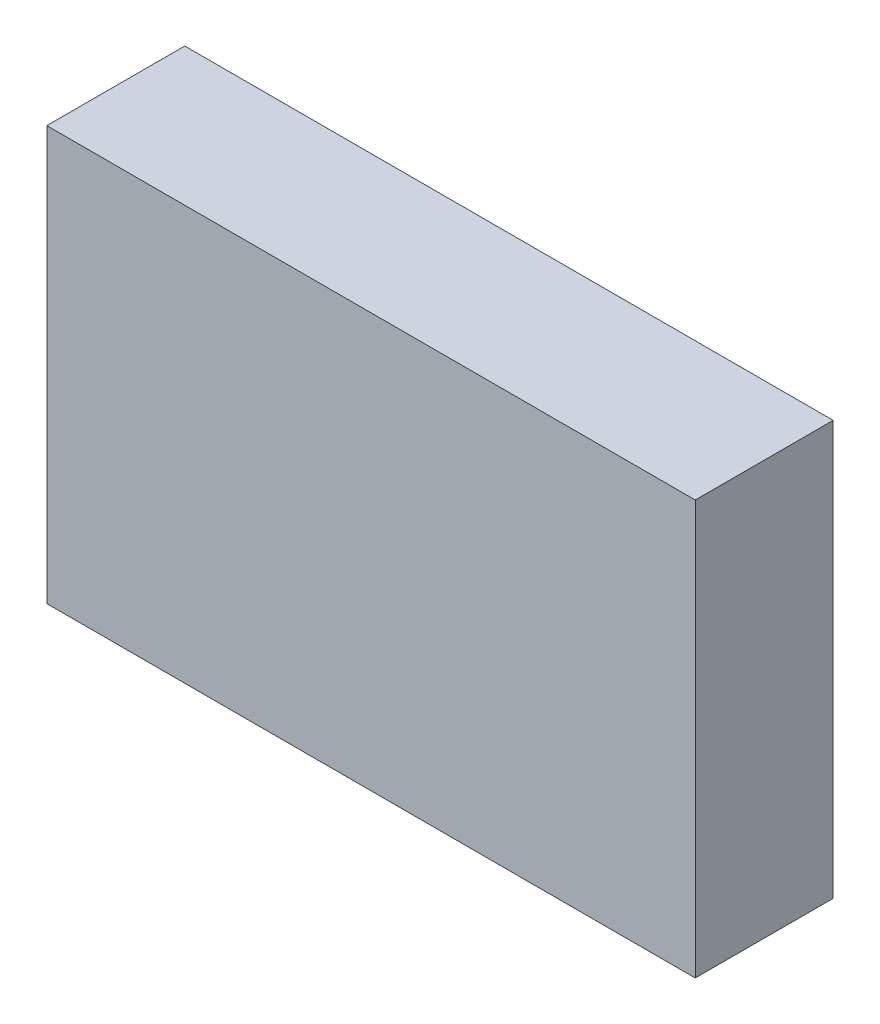
ISO-10303-21;
HEADER;
FILE_DESCRIPTION(('STEP AP214'),'2;1');
FILE_NAME('part.step','',(''),(''),'','','');
FILE_SCHEMA(('AUTOMOTIVE_DESIGN { 1 0 10303 214 1 1 1 1 }'));
ENDSEC;
DATA;
#1=APPLICATION_CONTEXT('core data for automotive mechanical design processes');
#2=APPLICATION_PROTOCOL_DEFINITION('international standard','automotive_design',2000,#1);
#3=PRODUCT_CONTEXT('',#1,'mechanical');
#4=PRODUCT('Part','Part','',(#3));
#5=PRODUCT_RELATED_PRODUCT_CATEGORY('part','',(#4));
#6=PRODUCT_DEFINITION_FORMATION('','',#4);
#7=PRODUCT_DEFINITION_CONTEXT('part definition',#1,'design');
#8=PRODUCT_DEFINITION('design','',#6,#7);
#9=PRODUCT_DEFINITION_SHAPE('','',#8);
#10=(LENGTH_UNIT() NAMED_UNIT(*) SI_UNIT(.MILLI.,.METRE.));
#11=(NAMED_UNIT(*) PLANE_ANGLE_UNIT() SI_UNIT($,.RADIAN.));
#12=(NAMED_UNIT(*) SI_UNIT($,.STERADIAN.) SOLID_ANGLE_UNIT());
#13=UNCERTAINTY_MEASURE_WITH_UNIT(LENGTH_MEASURE(1.E-05),#10,'distance_accuracy_value','');
#14=(GEOMETRIC_REPRESENTATION_CONTEXT(3) GLOBAL_UNCERTAINTY_ASSIGNED_CONTEXT((#13)) GLOBAL_UNIT_ASSIGNED_CONTEXT((#10,
#11,#12)) REPRESENTATION_CONTEXT('',''));
#15=CARTESIAN_POINT('',(0.,0.,0.));
#16=DIRECTION('',(0.,0.,1.));
#17=DIRECTION('',(1.,0.,0.));
#18=AXIS2_PLACEMENT_3D('',#15,#16,#17);
#19=CARTESIAN_POINT('',(-2.4016,-1.45,1.));
#20=DIRECTION('',(1.,0.,0.));
#21=DIRECTION('',(0.,0.,-1.));
#22=AXIS2_PLACEMENT_3D('',#19,#20,#21);
#23=PLANE('',#22);
#24=DIRECTION('',(0.,-1.,0.));
#25=VECTOR('',#24,1.);
#26=CARTESIAN_POINT('',(-2.4016,-1.45,0.));
#27=LINE('',#26,#25);
#28=CARTESIAN_POINT('',(-2.4016,1.5516,0.));
#29=VERTEX_POINT('',#28);
#30=CARTESIAN_POINT('',(-2.4016,-1.45,0.));
#31=VERTEX_POINT('',#30);
#32=EDGE_CURVE('E95',#29,#31,#27,.T.);
#33=ORIENTED_EDGE('',*,*,#32,.T.);
#34=DIRECTION('',(0.,0.,-1.));
#35=VECTOR('',#34,1.);
#36=CARTESIAN_POINT('',(-2.4016,-1.45,1.));
#37=LINE('',#36,#35);
#38=CARTESIAN_POINT('',(-2.4016,-1.45,1.));
#39=VERTEX_POINT('',#38);
#40=EDGE_CURVE('E11',#39,#31,#37,.T.);
#41=ORIENTED_EDGE('',*,*,#40,.F.);
#42=DIRECTION('',(0.,-1.,0.));
#43=VECTOR('',#42,1.);
#44=CARTESIAN_POINT('',(-2.4016,-1.45,1.));
#45=LINE('',#44,#43);
#46=CARTESIAN_POINT('',(-2.4016,1.5516,1.));
#47=VERTEX_POINT('',#46);
#48=EDGE_CURVE('E83',#47,#39,#45,.T.);
#49=ORIENTED_EDGE('',*,*,#48,.F.);
#50=DIRECTION('',(0.,0.,-1.));
#51=VECTOR('',#50,1.);
#52=CARTESIAN_POINT('',(-2.4016,1.5516,1.));
#53=LINE('',#52,#51);
#54=EDGE_CURVE('E91',#47,#29,#53,.T.);
#55=ORIENTED_EDGE('',*,*,#54,.T.);
#56=EDGE_LOOP('',(#33,#41,#49,#55));
#57=FACE_BOUND('',#56,.T.);
#58=ADVANCED_FACE('F32',(#57),#23,.F.);
#59=CARTESIAN_POINT('',(2.3,-1.45,1.));
#60=DIRECTION('',(0.,1.,0.));
#61=DIRECTION('',(0.,0.,1.));
#62=AXIS2_PLACEMENT_3D('',#59,#60,#61);
#63=PLANE('',#62);
#64=DIRECTION('',(1.,0.,0.));
#65=VECTOR('',#64,1.);
#66=CARTESIAN_POINT('',(2.3,-1.45,0.));
#67=LINE('',#66,#65);
#68=CARTESIAN_POINT('',(2.3,-1.45,0.));
#69=VERTEX_POINT('',#68);
#70=EDGE_CURVE('E87',#31,#69,#67,.T.);
#71=ORIENTED_EDGE('',*,*,#70,.T.);
#72=DIRECTION('',(0.,0.,-1.));
#73=VECTOR('',#72,1.);
#74=CARTESIAN_POINT('',(2.3,-1.45,1.));
#75=LINE('',#74,#73);
#76=CARTESIAN_POINT('',(2.3,-1.45,1.));
#77=VERTEX_POINT('',#76);
#78=EDGE_CURVE('E40',#77,#69,#75,.T.);
#79=ORIENTED_EDGE('',*,*,#78,.F.);
#80=DIRECTION('',(1.,0.,0.));
#81=VECTOR('',#80,1.);
#82=CARTESIAN_POINT('',(2.3,-1.45,1.));
#83=LINE('',#82,#81);
#84=EDGE_CURVE('E78',#39,#77,#83,.T.);
#85=ORIENTED_EDGE('',*,*,#84,.F.);
#86=ORIENTED_EDGE('',*,*,#40,.T.);
#87=EDGE_LOOP('',(#71,#79,#85,#86));
#88=FACE_BOUND('',#87,.T.);
#89=ADVANCED_FACE('F86',(#88),#63,.F.);
#90=CARTESIAN_POINT('',(2.3,1.5516,1.));
#91=DIRECTION('',(-1.,0.,0.));
#92=DIRECTION('',(0.,0.,1.));
#93=AXIS2_PLACEMENT_3D('',#90,#91,#92);
#94=PLANE('',#93);
#95=DIRECTION('',(0.,1.,0.));
#96=VECTOR('',#95,1.);
#97=CARTESIAN_POINT('',(2.3,1.5516,0.));
#98=LINE('',#97,#96);
#99=CARTESIAN_POINT('',(2.3,1.5516,0.));
#100=VERTEX_POINT('',#99);
#101=EDGE_CURVE('E65',#69,#100,#98,.T.);
#102=ORIENTED_EDGE('',*,*,#101,.T.);
#103=DIRECTION('',(0.,0.,-1.));
#104=VECTOR('',#103,1.);
#105=CARTESIAN_POINT('',(2.3,1.5516,1.));
#106=LINE('',#105,#104);
#107=CARTESIAN_POINT('',(2.3,1.5516,1.));
#108=VERTEX_POINT('',#107);
#109=EDGE_CURVE('E88',#108,#100,#106,.T.);
#110=ORIENTED_EDGE('',*,*,#109,.F.);
#111=DIRECTION('',(0.,1.,0.));
#112=VECTOR('',#111,1.);
#113=CARTESIAN_POINT('',(2.3,1.5516,1.));
#114=LINE('',#113,#112);
#115=EDGE_CURVE('E81',#77,#108,#114,.T.);
#116=ORIENTED_EDGE('',*,*,#115,.F.);
#117=ORIENTED_EDGE('',*,*,#78,.T.);
#118=EDGE_LOOP('',(#102,#110,#116,#117));
#119=FACE_BOUND('',#118,.T.);
#120=ADVANCED_FACE('F89',(#119),#94,.F.);
#121=CARTESIAN_POINT('',(-2.4016,1.5516,1.));
#122=DIRECTION('',(0.,-1.,0.));
#123=DIRECTION('',(0.,0.,-1.));
#124=AXIS2_PLACEMENT_3D('',#121,#122,#123);
#125=PLANE('',#124);
#126=DIRECTION('',(-1.,0.,0.));
#127=VECTOR('',#126,1.);
#128=CARTESIAN_POINT('',(-2.4016,1.5516,0.));
#129=LINE('',#128,#127);
#130=EDGE_CURVE('E71',#100,#29,#129,.T.);
#131=ORIENTED_EDGE('',*,*,#130,.T.);
#132=ORIENTED_EDGE('',*,*,#54,.F.);
#133=DIRECTION('',(-1.,0.,0.));
#134=VECTOR('',#133,1.);
#135=CARTESIAN_POINT('',(-2.4016,1.5516,1.));
#136=LINE('',#135,#134);
#137=EDGE_CURVE('E48',#108,#47,#136,.T.);
#138=ORIENTED_EDGE('',*,*,#137,.F.);
#139=ORIENTED_EDGE('',*,*,#109,.T.);
#140=EDGE_LOOP('',(#131,#132,#138,#139));
#141=FACE_BOUND('',#140,.T.);
#142=ADVANCED_FACE('F102',(#141),#125,.F.);
#143=CARTESIAN_POINT('',(0.,0.,1.));
#144=DIRECTION('',(0.,0.,-1.));
#145=DIRECTION('',(-1.,0.,0.));
#146=AXIS2_PLACEMENT_3D('',#143,#144,#145);
#147=PLANE('',#146);
#148=ORIENTED_EDGE('',*,*,#48,.T.);
#149=ORIENTED_EDGE('',*,*,#84,.T.);
#150=ORIENTED_EDGE('',*,*,#115,.T.);
#151=ORIENTED_EDGE('',*,*,#137,.T.);
#152=EDGE_LOOP('',(#148,#149,#150,#151));
#153=FACE_BOUND('',#152,.T.);
#154=ADVANCED_FACE('F79',(#153),#147,.F.);
#155=CARTESIAN_POINT('',(0.,0.,0.));
#156=DIRECTION('',(0.,0.,-1.));
#157=DIRECTION('',(-1.,0.,0.));
#158=AXIS2_PLACEMENT_3D('',#155,#156,#157);
#159=PLANE('',#158);
#160=ORIENTED_EDGE('',*,*,#32,.F.);
#161=ORIENTED_EDGE('',*,*,#130,.F.);
#162=ORIENTED_EDGE('',*,*,#101,.F.);
#163=ORIENTED_EDGE('',*,*,#70,.F.);
#164=EDGE_LOOP('',(#160,#161,#162,#163));
#165=FACE_BOUND('',#164,.T.);
#166=ADVANCED_FACE('F105',(#165),#159,.T.);
#167=CLOSED_SHELL('',(#58,#89,#120,#142,#154,#166));
#168=MANIFOLD_SOLID_BREP('B2',#167);
#169=ADVANCED_BREP_SHAPE_REPRESENTATION('',(#18,#168),#14);
#170=SHAPE_DEFINITION_REPRESENTATION(#9,#169);
ENDSEC;
END-ISO-10303-21;
